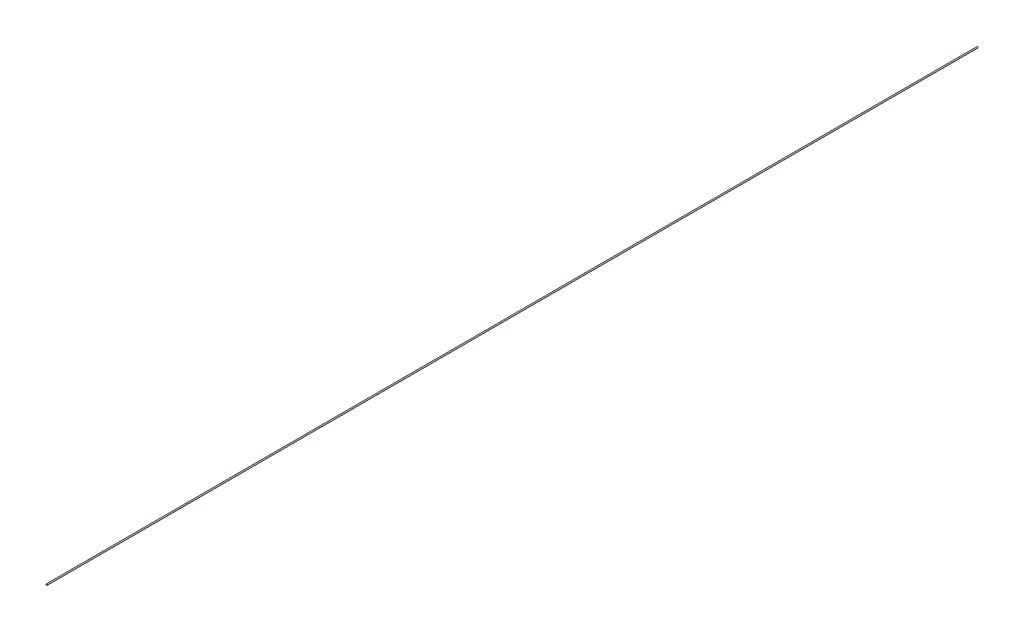
ISO-10303-21;
HEADER;
FILE_DESCRIPTION(('STEP AP214'),'2;1');
FILE_NAME('part.step','',(''),(''),'','','');
FILE_SCHEMA(('AUTOMOTIVE_DESIGN { 1 0 10303 214 1 1 1 1 }'));
ENDSEC;
DATA;
#1=APPLICATION_CONTEXT('core data for automotive mechanical design processes');
#2=APPLICATION_PROTOCOL_DEFINITION('international standard','automotive_design',2000,#1);
#3=PRODUCT_CONTEXT('',#1,'mechanical');
#4=PRODUCT('Part','Part','',(#3));
#5=PRODUCT_RELATED_PRODUCT_CATEGORY('part','',(#4));
#6=PRODUCT_DEFINITION_FORMATION('','',#4);
#7=PRODUCT_DEFINITION_CONTEXT('part definition',#1,'design');
#8=PRODUCT_DEFINITION('design','',#6,#7);
#9=PRODUCT_DEFINITION_SHAPE('','',#8);
#10=(LENGTH_UNIT() NAMED_UNIT(*) SI_UNIT(.MILLI.,.METRE.));
#11=(NAMED_UNIT(*) PLANE_ANGLE_UNIT() SI_UNIT($,.RADIAN.));
#12=(NAMED_UNIT(*) SI_UNIT($,.STERADIAN.) SOLID_ANGLE_UNIT());
#13=UNCERTAINTY_MEASURE_WITH_UNIT(LENGTH_MEASURE(1.E-05),#10,'distance_accuracy_value','');
#14=(GEOMETRIC_REPRESENTATION_CONTEXT(3) GLOBAL_UNCERTAINTY_ASSIGNED_CONTEXT((#13)) GLOBAL_UNIT_ASSIGNED_CONTEXT((#10,
#11,#12)) REPRESENTATION_CONTEXT('',''));
#15=CARTESIAN_POINT('',(0.,0.,0.));
#16=DIRECTION('',(0.,0.,1.));
#17=DIRECTION('',(1.,0.,0.));
#18=AXIS2_PLACEMENT_3D('',#15,#16,#17);
#19=CARTESIAN_POINT('',(0.,0.,130356.864));
#20=DIRECTION('',(0.,0.,-1.));
#21=DIRECTION('',(-1.,0.,0.));
#22=AXIS2_PLACEMENT_3D('',#19,#20,#21);
#23=CYLINDRICAL_SURFACE('',#22,50.8);
#24=CARTESIAN_POINT('',(0.,0.,130356.864));
#25=DIRECTION('',(0.,0.,1.));
#26=DIRECTION('',(1.,0.,0.));
#27=AXIS2_PLACEMENT_3D('',#24,#25,#26);
#28=CIRCLE('',#27,50.8);
#29=CARTESIAN_POINT('',(50.8,0.,130356.864));
#30=VERTEX_POINT('',#29);
#31=EDGE_CURVE('E53',#30,#30,#28,.T.);
#32=ORIENTED_EDGE('',*,*,#31,.T.);
#33=EDGE_LOOP('',(#32));
#34=FACE_BOUND('',#33,.T.);
#35=CARTESIAN_POINT('',(0.,0.,0.));
#36=DIRECTION('',(0.,0.,1.));
#37=DIRECTION('',(1.,0.,0.));
#38=AXIS2_PLACEMENT_3D('',#35,#36,#37);
#39=CIRCLE('',#38,50.8);
#40=CARTESIAN_POINT('',(50.8,0.,0.));
#41=VERTEX_POINT('',#40);
#42=EDGE_CURVE('E58',#41,#41,#39,.T.);
#43=ORIENTED_EDGE('',*,*,#42,.F.);
#44=EDGE_LOOP('',(#43));
#45=FACE_BOUND('',#44,.T.);
#46=ADVANCED_FACE('F50',(#34,#45),#23,.F.);
#47=CARTESIAN_POINT('',(0.,0.,130356.864));
#48=DIRECTION('',(0.,0.,-1.));
#49=DIRECTION('',(-1.,0.,0.));
#50=AXIS2_PLACEMENT_3D('',#47,#48,#49);
#51=CYLINDRICAL_SURFACE('',#50,88.9);
#52=CARTESIAN_POINT('',(0.,0.,130356.864));
#53=DIRECTION('',(0.,0.,1.));
#54=DIRECTION('',(1.,0.,0.));
#55=AXIS2_PLACEMENT_3D('',#52,#53,#54);
#56=CIRCLE('',#55,88.9);
#57=CARTESIAN_POINT('',(88.9,0.,130356.864));
#58=VERTEX_POINT('',#57);
#59=EDGE_CURVE('E10',#58,#58,#56,.T.);
#60=ORIENTED_EDGE('',*,*,#59,.F.);
#61=EDGE_LOOP('',(#60));
#62=FACE_BOUND('',#61,.T.);
#63=CARTESIAN_POINT('',(0.,0.,0.));
#64=DIRECTION('',(0.,0.,1.));
#65=DIRECTION('',(1.,0.,0.));
#66=AXIS2_PLACEMENT_3D('',#63,#64,#65);
#67=CIRCLE('',#66,88.9);
#68=CARTESIAN_POINT('',(88.9,0.,0.));
#69=VERTEX_POINT('',#68);
#70=EDGE_CURVE('E49',#69,#69,#67,.T.);
#71=ORIENTED_EDGE('',*,*,#70,.T.);
#72=EDGE_LOOP('',(#71));
#73=FACE_BOUND('',#72,.T.);
#74=ADVANCED_FACE('F70',(#62,#73),#51,.T.);
#75=CARTESIAN_POINT('',(0.,0.,130356.864));
#76=DIRECTION('',(0.,0.,1.));
#77=DIRECTION('',(1.,0.,0.));
#78=AXIS2_PLACEMENT_3D('',#75,#76,#77);
#79=PLANE('',#78);
#80=ORIENTED_EDGE('',*,*,#31,.F.);
#81=EDGE_LOOP('',(#80));
#82=FACE_BOUND('',#81,.T.);
#83=ORIENTED_EDGE('',*,*,#59,.T.);
#84=EDGE_LOOP('',(#83));
#85=FACE_BOUND('',#84,.T.);
#86=ADVANCED_FACE('F72',(#82,#85),#79,.T.);
#87=CARTESIAN_POINT('',(0.,0.,0.));
#88=DIRECTION('',(0.,0.,1.));
#89=DIRECTION('',(1.,0.,0.));
#90=AXIS2_PLACEMENT_3D('',#87,#88,#89);
#91=PLANE('',#90);
#92=ORIENTED_EDGE('',*,*,#42,.T.);
#93=EDGE_LOOP('',(#92));
#94=FACE_BOUND('',#93,.T.);
#95=ORIENTED_EDGE('',*,*,#70,.F.);
#96=EDGE_LOOP('',(#95));
#97=FACE_BOUND('',#96,.T.);
#98=ADVANCED_FACE('F69',(#94,#97),#91,.F.);
#99=CLOSED_SHELL('',(#46,#74,#86,#98));
#100=MANIFOLD_SOLID_BREP('B2',#99);
#101=ADVANCED_BREP_SHAPE_REPRESENTATION('',(#18,#100),#14);
#102=SHAPE_DEFINITION_REPRESENTATION(#9,#101);
ENDSEC;
END-ISO-10303-21;
